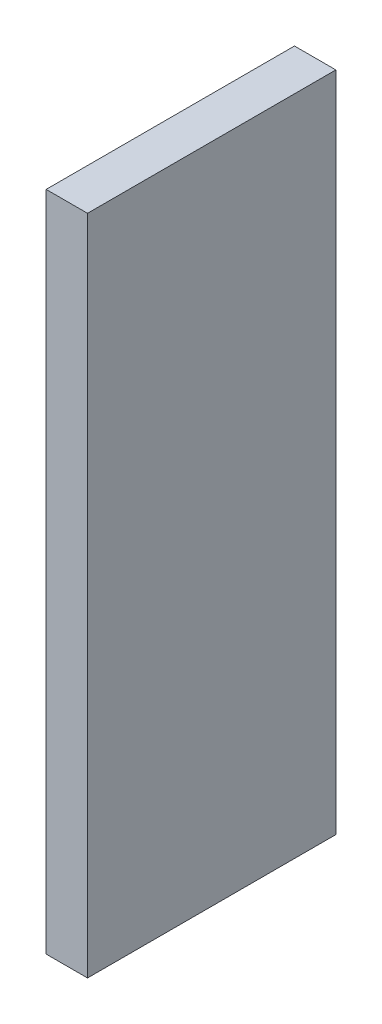
ISO-10303-21;
HEADER;
FILE_DESCRIPTION(('STEP AP214'),'2;1');
FILE_NAME('part.step','',(''),(''),'','','');
FILE_SCHEMA(('AUTOMOTIVE_DESIGN { 1 0 10303 214 1 1 1 1 }'));
ENDSEC;
DATA;
#1=APPLICATION_CONTEXT('core data for automotive mechanical design processes');
#2=APPLICATION_PROTOCOL_DEFINITION('international standard','automotive_design',2000,#1);
#3=PRODUCT_CONTEXT('',#1,'mechanical');
#4=PRODUCT('Part','Part','',(#3));
#5=PRODUCT_RELATED_PRODUCT_CATEGORY('part','',(#4));
#6=PRODUCT_DEFINITION_FORMATION('','',#4);
#7=PRODUCT_DEFINITION_CONTEXT('part definition',#1,'design');
#8=PRODUCT_DEFINITION('design','',#6,#7);
#9=PRODUCT_DEFINITION_SHAPE('','',#8);
#10=(LENGTH_UNIT() NAMED_UNIT(*) SI_UNIT(.MILLI.,.METRE.));
#11=(NAMED_UNIT(*) PLANE_ANGLE_UNIT() SI_UNIT($,.RADIAN.));
#12=(NAMED_UNIT(*) SI_UNIT($,.STERADIAN.) SOLID_ANGLE_UNIT());
#13=UNCERTAINTY_MEASURE_WITH_UNIT(LENGTH_MEASURE(1.E-05),#10,'distance_accuracy_value','');
#14=(GEOMETRIC_REPRESENTATION_CONTEXT(3) GLOBAL_UNCERTAINTY_ASSIGNED_CONTEXT((#13)) GLOBAL_UNIT_ASSIGNED_CONTEXT((#10,
#11,#12)) REPRESENTATION_CONTEXT('',''));
#15=CARTESIAN_POINT('',(0.,0.,0.));
#16=DIRECTION('',(0.,0.,1.));
#17=DIRECTION('',(1.,0.,0.));
#18=AXIS2_PLACEMENT_3D('',#15,#16,#17);
#19=CARTESIAN_POINT('',(12.7,-101.6,-38.1));
#20=DIRECTION('',(0.,0.,1.));
#21=DIRECTION('',(1.,0.,0.));
#22=AXIS2_PLACEMENT_3D('',#19,#20,#21);
#23=PLANE('',#22);
#24=DIRECTION('',(0.,1.,0.));
#25=VECTOR('',#24,1.);
#26=CARTESIAN_POINT('',(0.,-101.6,-38.1));
#27=LINE('',#26,#25);
#28=CARTESIAN_POINT('',(0.,-101.6,-38.1));
#29=VERTEX_POINT('',#28);
#30=CARTESIAN_POINT('',(0.,101.6,-38.1));
#31=VERTEX_POINT('',#30);
#32=EDGE_CURVE('E109',#29,#31,#27,.T.);
#33=ORIENTED_EDGE('',*,*,#32,.T.);
#34=DIRECTION('',(-1.,0.,0.));
#35=VECTOR('',#34,1.);
#36=CARTESIAN_POINT('',(12.7,101.6,-38.1));
#37=LINE('',#36,#35);
#38=CARTESIAN_POINT('',(12.7,101.6,-38.1));
#39=VERTEX_POINT('',#38);
#40=EDGE_CURVE('E11',#39,#31,#37,.T.);
#41=ORIENTED_EDGE('',*,*,#40,.F.);
#42=DIRECTION('',(0.,1.,0.));
#43=VECTOR('',#42,1.);
#44=CARTESIAN_POINT('',(12.7,-101.6,-38.1));
#45=LINE('',#44,#43);
#46=CARTESIAN_POINT('',(12.7,-101.6,-38.1));
#47=VERTEX_POINT('',#46);
#48=EDGE_CURVE('E93',#47,#39,#45,.T.);
#49=ORIENTED_EDGE('',*,*,#48,.F.);
#50=DIRECTION('',(-1.,0.,0.));
#51=VECTOR('',#50,1.);
#52=CARTESIAN_POINT('',(12.7,-101.6,-38.1));
#53=LINE('',#52,#51);
#54=EDGE_CURVE('E105',#47,#29,#53,.T.);
#55=ORIENTED_EDGE('',*,*,#54,.T.);
#56=EDGE_LOOP('',(#33,#41,#49,#55));
#57=FACE_BOUND('',#56,.T.);
#58=ADVANCED_FACE('F41',(#57),#23,.F.);
#59=CARTESIAN_POINT('',(12.7,101.6,38.1));
#60=DIRECTION('',(0.,-1.,0.));
#61=DIRECTION('',(0.,0.,-1.));
#62=AXIS2_PLACEMENT_3D('',#59,#60,#61);
#63=PLANE('',#62);
#64=DIRECTION('',(0.,0.,1.));
#65=VECTOR('',#64,1.);
#66=CARTESIAN_POINT('',(0.,101.6,38.1));
#67=LINE('',#66,#65);
#68=CARTESIAN_POINT('',(0.,101.6,38.1));
#69=VERTEX_POINT('',#68);
#70=EDGE_CURVE('E98',#31,#69,#67,.T.);
#71=ORIENTED_EDGE('',*,*,#70,.T.);
#72=DIRECTION('',(-1.,0.,0.));
#73=VECTOR('',#72,1.);
#74=CARTESIAN_POINT('',(12.7,101.6,38.1));
#75=LINE('',#74,#73);
#76=CARTESIAN_POINT('',(12.7,101.6,38.1));
#77=VERTEX_POINT('',#76);
#78=EDGE_CURVE('E50',#77,#69,#75,.T.);
#79=ORIENTED_EDGE('',*,*,#78,.F.);
#80=DIRECTION('',(0.,0.,1.));
#81=VECTOR('',#80,1.);
#82=CARTESIAN_POINT('',(12.7,101.6,38.1));
#83=LINE('',#82,#81);
#84=EDGE_CURVE('E88',#39,#77,#83,.T.);
#85=ORIENTED_EDGE('',*,*,#84,.F.);
#86=ORIENTED_EDGE('',*,*,#40,.T.);
#87=EDGE_LOOP('',(#71,#79,#85,#86));
#88=FACE_BOUND('',#87,.T.);
#89=ADVANCED_FACE('F97',(#88),#63,.F.);
#90=CARTESIAN_POINT('',(12.7,-101.6,38.1));
#91=DIRECTION('',(0.,0.,-1.));
#92=DIRECTION('',(-1.,0.,0.));
#93=AXIS2_PLACEMENT_3D('',#90,#91,#92);
#94=PLANE('',#93);
#95=DIRECTION('',(0.,-1.,0.));
#96=VECTOR('',#95,1.);
#97=CARTESIAN_POINT('',(0.,-101.6,38.1));
#98=LINE('',#97,#96);
#99=CARTESIAN_POINT('',(0.,-101.6,38.1));
#100=VERTEX_POINT('',#99);
#101=EDGE_CURVE('E75',#69,#100,#98,.T.);
#102=ORIENTED_EDGE('',*,*,#101,.T.);
#103=DIRECTION('',(-1.,0.,0.));
#104=VECTOR('',#103,1.);
#105=CARTESIAN_POINT('',(12.7,-101.6,38.1));
#106=LINE('',#105,#104);
#107=CARTESIAN_POINT('',(12.7,-101.6,38.1));
#108=VERTEX_POINT('',#107);
#109=EDGE_CURVE('E100',#108,#100,#106,.T.);
#110=ORIENTED_EDGE('',*,*,#109,.F.);
#111=DIRECTION('',(0.,-1.,0.));
#112=VECTOR('',#111,1.);
#113=CARTESIAN_POINT('',(12.7,-101.6,38.1));
#114=LINE('',#113,#112);
#115=EDGE_CURVE('E91',#77,#108,#114,.T.);
#116=ORIENTED_EDGE('',*,*,#115,.F.);
#117=ORIENTED_EDGE('',*,*,#78,.T.);
#118=EDGE_LOOP('',(#102,#110,#116,#117));
#119=FACE_BOUND('',#118,.T.);
#120=ADVANCED_FACE('F101',(#119),#94,.F.);
#121=CARTESIAN_POINT('',(12.7,-101.6,38.1));
#122=DIRECTION('',(0.,1.,0.));
#123=DIRECTION('',(0.,0.,1.));
#124=AXIS2_PLACEMENT_3D('',#121,#122,#123);
#125=PLANE('',#124);
#126=DIRECTION('',(0.,0.,-1.));
#127=VECTOR('',#126,1.);
#128=CARTESIAN_POINT('',(0.,-101.6,38.1));
#129=LINE('',#128,#127);
#130=EDGE_CURVE('E81',#100,#29,#129,.T.);
#131=ORIENTED_EDGE('',*,*,#130,.T.);
#132=ORIENTED_EDGE('',*,*,#54,.F.);
#133=DIRECTION('',(0.,0.,-1.));
#134=VECTOR('',#133,1.);
#135=CARTESIAN_POINT('',(12.7,-101.6,38.1));
#136=LINE('',#135,#134);
#137=EDGE_CURVE('E58',#108,#47,#136,.T.);
#138=ORIENTED_EDGE('',*,*,#137,.F.);
#139=ORIENTED_EDGE('',*,*,#109,.T.);
#140=EDGE_LOOP('',(#131,#132,#138,#139));
#141=FACE_BOUND('',#140,.T.);
#142=ADVANCED_FACE('F122',(#141),#125,.F.);
#143=CARTESIAN_POINT('',(12.7,0.,0.));
#144=DIRECTION('',(-1.,0.,0.));
#145=DIRECTION('',(0.,0.,1.));
#146=AXIS2_PLACEMENT_3D('',#143,#144,#145);
#147=PLANE('',#146);
#148=ORIENTED_EDGE('',*,*,#48,.T.);
#149=ORIENTED_EDGE('',*,*,#84,.T.);
#150=ORIENTED_EDGE('',*,*,#115,.T.);
#151=ORIENTED_EDGE('',*,*,#137,.T.);
#152=EDGE_LOOP('',(#148,#149,#150,#151));
#153=FACE_BOUND('',#152,.T.);
#154=ADVANCED_FACE('F89',(#153),#147,.F.);
#155=CARTESIAN_POINT('',(0.,0.,0.));
#156=DIRECTION('',(-1.,0.,0.));
#157=DIRECTION('',(0.,0.,1.));
#158=AXIS2_PLACEMENT_3D('',#155,#156,#157);
#159=PLANE('',#158);
#160=ORIENTED_EDGE('',*,*,#32,.F.);
#161=ORIENTED_EDGE('',*,*,#130,.F.);
#162=ORIENTED_EDGE('',*,*,#101,.F.);
#163=ORIENTED_EDGE('',*,*,#70,.F.);
#164=EDGE_LOOP('',(#160,#161,#162,#163));
#165=FACE_BOUND('',#164,.T.);
#166=ADVANCED_FACE('F125',(#165),#159,.T.);
#167=CLOSED_SHELL('',(#58,#89,#120,#142,#154,#166));
#168=MANIFOLD_SOLID_BREP('B2',#167);
#169=ADVANCED_BREP_SHAPE_REPRESENTATION('',(#18,#168),#14);
#170=SHAPE_DEFINITION_REPRESENTATION(#9,#169);
ENDSEC;
END-ISO-10303-21;
